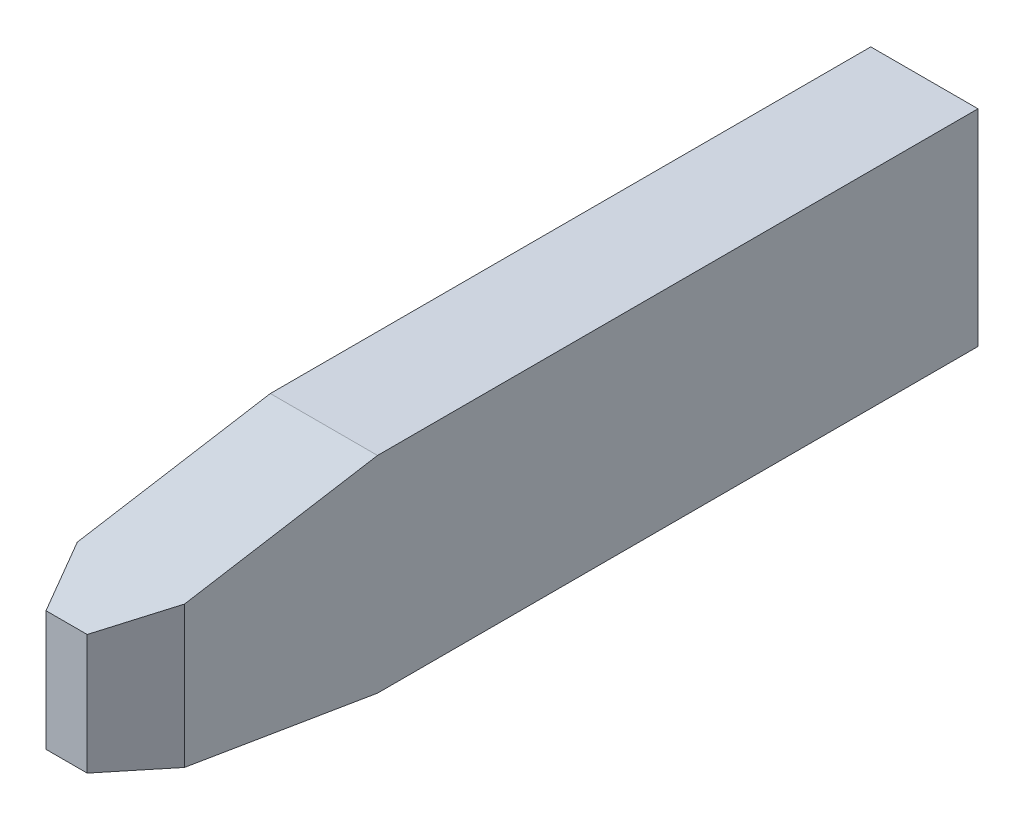
ISO-10303-21;
HEADER;
FILE_DESCRIPTION(('STEP AP214'),'2;1');
FILE_NAME('part.step','',(''),(''),'','','');
FILE_SCHEMA(('AUTOMOTIVE_DESIGN { 1 0 10303 214 1 1 1 1 }'));
ENDSEC;
DATA;
#1=APPLICATION_CONTEXT('core data for automotive mechanical design processes');
#2=APPLICATION_PROTOCOL_DEFINITION('international standard','automotive_design',2000,#1);
#3=PRODUCT_CONTEXT('',#1,'mechanical');
#4=PRODUCT('Part','Part','',(#3));
#5=PRODUCT_RELATED_PRODUCT_CATEGORY('part','',(#4));
#6=PRODUCT_DEFINITION_FORMATION('','',#4);
#7=PRODUCT_DEFINITION_CONTEXT('part definition',#1,'design');
#8=PRODUCT_DEFINITION('design','',#6,#7);
#9=PRODUCT_DEFINITION_SHAPE('','',#8);
#10=(LENGTH_UNIT() NAMED_UNIT(*) SI_UNIT(.MILLI.,.METRE.));
#11=(NAMED_UNIT(*) PLANE_ANGLE_UNIT() SI_UNIT($,.RADIAN.));
#12=(NAMED_UNIT(*) SI_UNIT($,.STERADIAN.) SOLID_ANGLE_UNIT());
#13=UNCERTAINTY_MEASURE_WITH_UNIT(LENGTH_MEASURE(1.E-05),#10,'distance_accuracy_value','');
#14=(GEOMETRIC_REPRESENTATION_CONTEXT(3) GLOBAL_UNCERTAINTY_ASSIGNED_CONTEXT((#13)) GLOBAL_UNIT_ASSIGNED_CONTEXT((#10,
#11,#12)) REPRESENTATION_CONTEXT('',''));
#15=CARTESIAN_POINT('',(0.,0.,0.));
#16=DIRECTION('',(0.,0.,1.));
#17=DIRECTION('',(1.,0.,0.));
#18=AXIS2_PLACEMENT_3D('',#15,#16,#17);
#19=CARTESIAN_POINT('',(-0.0937280755988341,0.116319500201119,-1.15));
#20=DIRECTION('',(0.,0.,1.));
#21=DIRECTION('',(1.,0.,0.));
#22=AXIS2_PLACEMENT_3D('',#19,#20,#21);
#23=PLANE('',#22);
#24=DIRECTION('',(-1.,0.,0.));
#25=VECTOR('',#24,1.);
#26=CARTESIAN_POINT('',(0.62500000001,1.57000000001,-1.15000000001));
#27=LINE('',#26,#25);
#28=CARTESIAN_POINT('',(0.625,1.57,-1.15));
#29=VERTEX_POINT('',#28);
#30=CARTESIAN_POINT('',(0.375,1.57,-1.15));
#31=VERTEX_POINT('',#30);
#32=EDGE_CURVE('E11',#29,#31,#27,.T.);
#33=ORIENTED_EDGE('',*,*,#32,.F.);
#34=DIRECTION('',(0.,1.,0.));
#35=VECTOR('',#34,1.);
#36=CARTESIAN_POINT('',(0.62500000001,1.09000000001,-1.15000000001));
#37=LINE('',#36,#35);
#38=CARTESIAN_POINT('',(0.625,1.09,-1.15));
#39=VERTEX_POINT('',#38);
#40=EDGE_CURVE('E24',#39,#29,#37,.T.);
#41=ORIENTED_EDGE('',*,*,#40,.F.);
#42=DIRECTION('',(-1.,0.,0.));
#43=VECTOR('',#42,1.);
#44=CARTESIAN_POINT('',(0.62500000001,1.09000000001,-1.15000000001));
#45=LINE('',#44,#43);
#46=CARTESIAN_POINT('',(0.375,1.09,-1.15));
#47=VERTEX_POINT('',#46);
#48=EDGE_CURVE('E142',#39,#47,#45,.T.);
#49=ORIENTED_EDGE('',*,*,#48,.T.);
#50=DIRECTION('',(0.,1.,0.));
#51=VECTOR('',#50,1.);
#52=CARTESIAN_POINT('',(0.37500000001,1.09000000001,-1.15000000001));
#53=LINE('',#52,#51);
#54=EDGE_CURVE('E140',#47,#31,#53,.T.);
#55=ORIENTED_EDGE('',*,*,#54,.T.);
#56=EDGE_LOOP('',(#33,#41,#49,#55));
#57=FACE_BOUND('',#56,.T.);
#58=ADVANCED_FACE('F17',(#57),#23,.F.);
#59=CARTESIAN_POINT('',(0.375,1.09,-1.85));
#60=DIRECTION('',(0.,-1.,0.));
#61=DIRECTION('',(0.,0.,-1.));
#62=AXIS2_PLACEMENT_3D('',#59,#60,#61);
#63=PLANE('',#62);
#64=ORIENTED_EDGE('',*,*,#48,.F.);
#65=DIRECTION('',(0.,0.,1.));
#66=VECTOR('',#65,1.);
#67=CARTESIAN_POINT('',(0.62500000001,1.09000000001,-1.15000000001));
#68=LINE('',#67,#66);
#69=CARTESIAN_POINT('',(0.625,1.09,0.25));
#70=VERTEX_POINT('',#69);
#71=EDGE_CURVE('E138',#39,#70,#68,.T.);
#72=ORIENTED_EDGE('',*,*,#71,.T.);
#73=DIRECTION('',(1.,0.,0.));
#74=VECTOR('',#73,1.);
#75=CARTESIAN_POINT('',(0.37500000001,1.09000000001,0.25000000001));
#76=LINE('',#75,#74);
#77=CARTESIAN_POINT('',(0.375,1.09,0.25));
#78=VERTEX_POINT('',#77);
#79=EDGE_CURVE('E135',#78,#70,#76,.T.);
#80=ORIENTED_EDGE('',*,*,#79,.F.);
#81=DIRECTION('',(0.,0.,1.));
#82=VECTOR('',#81,1.);
#83=CARTESIAN_POINT('',(0.37500000001,1.09000000001,-1.15000000001));
#84=LINE('',#83,#82);
#85=EDGE_CURVE('E132',#47,#78,#84,.T.);
#86=ORIENTED_EDGE('',*,*,#85,.F.);
#87=EDGE_LOOP('',(#64,#72,#80,#86));
#88=FACE_BOUND('',#87,.T.);
#89=ADVANCED_FACE('F163',(#88),#63,.T.);
#90=CARTESIAN_POINT('',(0.375,1.09,0.25));
#91=DIRECTION('',(0.,-0.986393923832136,0.164398987305406));
#92=DIRECTION('',(-1.,0.,0.));
#93=AXIS2_PLACEMENT_3D('',#90,#91,#92);
#94=PLANE('',#93);
#95=DIRECTION('',(0.,0.164398987323179,0.986393923829174));
#96=VECTOR('',#95,1.);
#97=CARTESIAN_POINT('',(0.37500000001,1.09000000001,0.25000000001));
#98=LINE('',#97,#96);
#99=CARTESIAN_POINT('',(0.375,1.165,0.7));
#100=VERTEX_POINT('',#99);
#101=EDGE_CURVE('E130',#78,#100,#98,.T.);
#102=ORIENTED_EDGE('',*,*,#101,.F.);
#103=ORIENTED_EDGE('',*,*,#79,.T.);
#104=DIRECTION('',(0.,0.164398987323179,0.986393923829174));
#105=VECTOR('',#104,1.);
#106=CARTESIAN_POINT('',(0.62500000001,1.09000000001,0.25000000001));
#107=LINE('',#106,#105);
#108=CARTESIAN_POINT('',(0.625,1.165,0.7));
#109=VERTEX_POINT('',#108);
#110=EDGE_CURVE('E128',#70,#109,#107,.T.);
#111=ORIENTED_EDGE('',*,*,#110,.T.);
#112=DIRECTION('',(-0.451739179899475,0.146668564942043,0.880011389359019));
#113=VECTOR('',#112,1.);
#114=CARTESIAN_POINT('',(0.62500000001,1.16500000001,0.70000000001));
#115=LINE('',#114,#113);
#116=CARTESIAN_POINT('',(0.548,1.19,0.85));
#117=VERTEX_POINT('',#116);
#118=EDGE_CURVE('E95',#109,#117,#115,.T.);
#119=ORIENTED_EDGE('',*,*,#118,.T.);
#120=DIRECTION('',(1.,0.,0.));
#121=VECTOR('',#120,1.);
#122=CARTESIAN_POINT('',(0.45200000001,1.19000000001,0.85000000001));
#123=LINE('',#122,#121);
#124=CARTESIAN_POINT('',(0.452,1.19,0.85));
#125=VERTEX_POINT('',#124);
#126=EDGE_CURVE('E124',#125,#117,#123,.T.);
#127=ORIENTED_EDGE('',*,*,#126,.F.);
#128=DIRECTION('',(-0.451739179899475,-0.146668564942043,-0.880011389359019));
#129=VECTOR('',#128,1.);
#130=CARTESIAN_POINT('',(0.45200000001,1.19000000001,0.85000000001));
#131=LINE('',#130,#129);
#132=EDGE_CURVE('E121',#125,#100,#131,.T.);
#133=ORIENTED_EDGE('',*,*,#132,.T.);
#134=EDGE_LOOP('',(#102,#103,#111,#119,#127,#133));
#135=FACE_BOUND('',#134,.T.);
#136=ADVANCED_FACE('F160',(#135),#94,.T.);
#137=CARTESIAN_POINT('',(0.375,1.19,0.85));
#138=DIRECTION('',(0.,0.,1.));
#139=DIRECTION('',(1.,0.,0.));
#140=AXIS2_PLACEMENT_3D('',#137,#138,#139);
#141=PLANE('',#140);
#142=ORIENTED_EDGE('',*,*,#126,.T.);
#143=DIRECTION('',(0.,-1.,0.));
#144=VECTOR('',#143,1.);
#145=CARTESIAN_POINT('',(0.54800000001,1.47000000001,0.85000000001));
#146=LINE('',#145,#144);
#147=CARTESIAN_POINT('',(0.548,1.47,0.85));
#148=VERTEX_POINT('',#147);
#149=EDGE_CURVE('E119',#148,#117,#146,.T.);
#150=ORIENTED_EDGE('',*,*,#149,.F.);
#151=DIRECTION('',(1.,0.,0.));
#152=VECTOR('',#151,1.);
#153=CARTESIAN_POINT('',(0.45200000001,1.47000000001,0.85000000001));
#154=LINE('',#153,#152);
#155=CARTESIAN_POINT('',(0.452,1.47,0.85));
#156=VERTEX_POINT('',#155);
#157=EDGE_CURVE('E100',#156,#148,#154,.T.);
#158=ORIENTED_EDGE('',*,*,#157,.F.);
#159=DIRECTION('',(0.,1.,0.));
#160=VECTOR('',#159,1.);
#161=CARTESIAN_POINT('',(0.45200000001,1.19000000001,0.85000000001));
#162=LINE('',#161,#160);
#163=EDGE_CURVE('E115',#125,#156,#162,.T.);
#164=ORIENTED_EDGE('',*,*,#163,.F.);
#165=EDGE_LOOP('',(#142,#150,#158,#164));
#166=FACE_BOUND('',#165,.T.);
#167=ADVANCED_FACE('F158',(#166),#141,.T.);
#168=CARTESIAN_POINT('',(0.375,1.57,0.25));
#169=DIRECTION('',(0.,1.,0.));
#170=DIRECTION('',(1.,0.,0.));
#171=AXIS2_PLACEMENT_3D('',#168,#169,#170);
#172=PLANE('',#171);
#173=DIRECTION('',(1.,0.,0.));
#174=VECTOR('',#173,1.);
#175=CARTESIAN_POINT('',(0.37500000001,1.57000000001,0.25000000001));
#176=LINE('',#175,#174);
#177=CARTESIAN_POINT('',(0.375,1.57,0.25));
#178=VERTEX_POINT('',#177);
#179=CARTESIAN_POINT('',(0.625,1.57,0.25));
#180=VERTEX_POINT('',#179);
#181=EDGE_CURVE('E113',#178,#180,#176,.T.);
#182=ORIENTED_EDGE('',*,*,#181,.T.);
#183=DIRECTION('',(0.,0.,-1.));
#184=VECTOR('',#183,1.);
#185=CARTESIAN_POINT('',(0.62500000001,1.57000000001,0.25000000001));
#186=LINE('',#185,#184);
#187=EDGE_CURVE('E84',#180,#29,#186,.T.);
#188=ORIENTED_EDGE('',*,*,#187,.T.);
#189=ORIENTED_EDGE('',*,*,#32,.T.);
#190=DIRECTION('',(0.,0.,-1.));
#191=VECTOR('',#190,1.);
#192=CARTESIAN_POINT('',(0.37500000001,1.57000000001,0.25000000001));
#193=LINE('',#192,#191);
#194=EDGE_CURVE('E109',#178,#31,#193,.T.);
#195=ORIENTED_EDGE('',*,*,#194,.F.);
#196=EDGE_LOOP('',(#182,#188,#189,#195));
#197=FACE_BOUND('',#196,.T.);
#198=ADVANCED_FACE('F145',(#197),#172,.T.);
#199=CARTESIAN_POINT('',(0.4135,1.33,0.775));
#200=DIRECTION('',(-0.889632145943004,0.,0.456677834917402));
#201=DIRECTION('',(0.,1.,0.));
#202=AXIS2_PLACEMENT_3D('',#199,#200,#201);
#203=PLANE('',#202);
#204=DIRECTION('',(0.,1.,0.));
#205=VECTOR('',#204,1.);
#206=CARTESIAN_POINT('',(0.37500000001,1.16500000001,0.70000000001));
#207=LINE('',#206,#205);
#208=CARTESIAN_POINT('',(0.375,1.495,0.7));
#209=VERTEX_POINT('',#208);
#210=EDGE_CURVE('E107',#100,#209,#207,.T.);
#211=ORIENTED_EDGE('',*,*,#210,.F.);
#212=ORIENTED_EDGE('',*,*,#132,.F.);
#213=ORIENTED_EDGE('',*,*,#163,.T.);
#214=DIRECTION('',(0.451739179899475,-0.146668564942043,0.880011389359019));
#215=VECTOR('',#214,1.);
#216=CARTESIAN_POINT('',(0.37500000001,1.49500000001,0.70000000001));
#217=LINE('',#216,#215);
#218=EDGE_CURVE('E105',#209,#156,#217,.T.);
#219=ORIENTED_EDGE('',*,*,#218,.F.);
#220=EDGE_LOOP('',(#211,#212,#213,#219));
#221=FACE_BOUND('',#220,.T.);
#222=ADVANCED_FACE('F155',(#221),#203,.T.);
#223=CARTESIAN_POINT('',(0.375,0.,-2.4));
#224=DIRECTION('',(-1.,0.,0.));
#225=DIRECTION('',(0.,0.,1.));
#226=AXIS2_PLACEMENT_3D('',#223,#224,#225);
#227=PLANE('',#226);
#228=DIRECTION('',(0.,0.164398987323179,-0.986393923829174));
#229=VECTOR('',#228,1.);
#230=CARTESIAN_POINT('',(0.37500000001,1.49500000001,0.70000000001));
#231=LINE('',#230,#229);
#232=EDGE_CURVE('E87',#209,#178,#231,.T.);
#233=ORIENTED_EDGE('',*,*,#232,.T.);
#234=ORIENTED_EDGE('',*,*,#194,.T.);
#235=ORIENTED_EDGE('',*,*,#54,.F.);
#236=ORIENTED_EDGE('',*,*,#85,.T.);
#237=ORIENTED_EDGE('',*,*,#101,.T.);
#238=ORIENTED_EDGE('',*,*,#210,.T.);
#239=EDGE_LOOP('',(#233,#234,#235,#236,#237,#238));
#240=FACE_BOUND('',#239,.T.);
#241=ADVANCED_FACE('F149',(#240),#227,.T.);
#242=CARTESIAN_POINT('',(0.625,0.,-2.4));
#243=DIRECTION('',(-1.,0.,0.));
#244=DIRECTION('',(0.,0.,1.));
#245=AXIS2_PLACEMENT_3D('',#242,#243,#244);
#246=PLANE('',#245);
#247=ORIENTED_EDGE('',*,*,#110,.F.);
#248=ORIENTED_EDGE('',*,*,#71,.F.);
#249=ORIENTED_EDGE('',*,*,#40,.T.);
#250=ORIENTED_EDGE('',*,*,#187,.F.);
#251=DIRECTION('',(0.,0.164398987323179,-0.986393923829174));
#252=VECTOR('',#251,1.);
#253=CARTESIAN_POINT('',(0.62500000001,1.49500000001,0.70000000001));
#254=LINE('',#253,#252);
#255=CARTESIAN_POINT('',(0.625,1.495,0.7));
#256=VERTEX_POINT('',#255);
#257=EDGE_CURVE('E79',#256,#180,#254,.T.);
#258=ORIENTED_EDGE('',*,*,#257,.F.);
#259=DIRECTION('',(0.,-1.,0.));
#260=VECTOR('',#259,1.);
#261=CARTESIAN_POINT('',(0.62500000001,1.49500000001,0.70000000001));
#262=LINE('',#261,#260);
#263=EDGE_CURVE('E83',#256,#109,#262,.T.);
#264=ORIENTED_EDGE('',*,*,#263,.T.);
#265=EDGE_LOOP('',(#247,#248,#249,#250,#258,#264));
#266=FACE_BOUND('',#265,.T.);
#267=ADVANCED_FACE('F82',(#266),#246,.F.);
#268=CARTESIAN_POINT('',(0.5865,1.33,0.775));
#269=DIRECTION('',(0.889632145943004,0.,0.456677834917402));
#270=DIRECTION('',(0.,-1.,0.));
#271=AXIS2_PLACEMENT_3D('',#268,#269,#270);
#272=PLANE('',#271);
#273=ORIENTED_EDGE('',*,*,#263,.F.);
#274=DIRECTION('',(0.451739179899475,0.146668564942043,-0.880011389359019));
#275=VECTOR('',#274,1.);
#276=CARTESIAN_POINT('',(0.54800000001,1.47000000001,0.85000000001));
#277=LINE('',#276,#275);
#278=EDGE_CURVE('E94',#148,#256,#277,.T.);
#279=ORIENTED_EDGE('',*,*,#278,.F.);
#280=ORIENTED_EDGE('',*,*,#149,.T.);
#281=ORIENTED_EDGE('',*,*,#118,.F.);
#282=EDGE_LOOP('',(#273,#279,#280,#281));
#283=FACE_BOUND('',#282,.T.);
#284=ADVANCED_FACE('F92',(#283),#272,.T.);
#285=CARTESIAN_POINT('',(0.375,1.47,0.85));
#286=DIRECTION('',(0.,0.986393923832136,0.164398987305406));
#287=DIRECTION('',(1.,0.,0.));
#288=AXIS2_PLACEMENT_3D('',#285,#286,#287);
#289=PLANE('',#288);
#290=ORIENTED_EDGE('',*,*,#157,.T.);
#291=ORIENTED_EDGE('',*,*,#278,.T.);
#292=ORIENTED_EDGE('',*,*,#257,.T.);
#293=ORIENTED_EDGE('',*,*,#181,.F.);
#294=ORIENTED_EDGE('',*,*,#232,.F.);
#295=ORIENTED_EDGE('',*,*,#218,.T.);
#296=EDGE_LOOP('',(#290,#291,#292,#293,#294,#295));
#297=FACE_BOUND('',#296,.T.);
#298=ADVANCED_FACE('F98',(#297),#289,.T.);
#299=CLOSED_SHELL('',(#58,#89,#136,#167,#198,#222,#241,#267,#284,#298));
#300=MANIFOLD_SOLID_BREP('B1',#299);
#301=ADVANCED_BREP_SHAPE_REPRESENTATION('',(#18,#300),#14);
#302=SHAPE_DEFINITION_REPRESENTATION(#9,#301);
ENDSEC;
END-ISO-10303-21;
